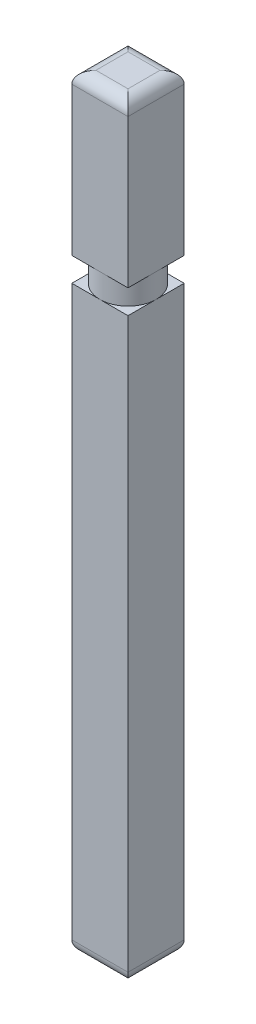
ISO-10303-21;
HEADER;
FILE_DESCRIPTION(('STEP AP214'),'2;1');
FILE_NAME('part.step','',(''),(''),'','','');
FILE_SCHEMA(('AUTOMOTIVE_DESIGN { 1 0 10303 214 1 1 1 1 }'));
ENDSEC;
DATA;
#1=APPLICATION_CONTEXT('core data for automotive mechanical design processes');
#2=APPLICATION_PROTOCOL_DEFINITION('international standard','automotive_design',2000,#1);
#3=PRODUCT_CONTEXT('',#1,'mechanical');
#4=PRODUCT('Part','Part','',(#3));
#5=PRODUCT_RELATED_PRODUCT_CATEGORY('part','',(#4));
#6=PRODUCT_DEFINITION_FORMATION('','',#4);
#7=PRODUCT_DEFINITION_CONTEXT('part definition',#1,'design');
#8=PRODUCT_DEFINITION('design','',#6,#7);
#9=PRODUCT_DEFINITION_SHAPE('','',#8);
#10=(LENGTH_UNIT() NAMED_UNIT(*) SI_UNIT(.MILLI.,.METRE.));
#11=(NAMED_UNIT(*) PLANE_ANGLE_UNIT() SI_UNIT($,.RADIAN.));
#12=(NAMED_UNIT(*) SI_UNIT($,.STERADIAN.) SOLID_ANGLE_UNIT());
#13=UNCERTAINTY_MEASURE_WITH_UNIT(LENGTH_MEASURE(1.E-05),#10,'distance_accuracy_value','');
#14=(GEOMETRIC_REPRESENTATION_CONTEXT(3) GLOBAL_UNCERTAINTY_ASSIGNED_CONTEXT((#13)) GLOBAL_UNIT_ASSIGNED_CONTEXT((#10,
#11,#12)) REPRESENTATION_CONTEXT('',''));
#15=CARTESIAN_POINT('',(0.,0.,0.));
#16=DIRECTION('',(0.,0.,1.));
#17=DIRECTION('',(1.,0.,0.));
#18=AXIS2_PLACEMENT_3D('',#15,#16,#17);
#19=CARTESIAN_POINT('',(0.,9.39,0.2));
#20=DIRECTION('',(-1.,0.,0.));
#21=DIRECTION('',(0.,0.,1.));
#22=AXIS2_PLACEMENT_3D('',#19,#20,#21);
#23=CYLINDRICAL_SURFACE('',#22,0.15);
#24=CARTESIAN_POINT('',(0.2,9.39,0.2));
#25=DIRECTION('',(-0.707106781186547,0.,0.707106781186548));
#26=DIRECTION('',(0.707106781186547,0.,0.707106781186547));
#27=AXIS2_PLACEMENT_3D('',#24,#25,#26);
#28=ELLIPSE('',#27,0.212132034355964,0.15);
#29=CARTESIAN_POINT('',(0.2,9.54,0.2));
#30=VERTEX_POINT('',#29);
#31=CARTESIAN_POINT('',(0.35,9.39,0.35));
#32=VERTEX_POINT('',#31);
#33=EDGE_CURVE('E201',#30,#32,#28,.F.);
#34=ORIENTED_EDGE('',*,*,#33,.F.);
#35=DIRECTION('',(1.,0.,0.));
#36=VECTOR('',#35,1.);
#37=CARTESIAN_POINT('',(0.,9.54,0.2));
#38=LINE('',#37,#36);
#39=CARTESIAN_POINT('',(-0.2,9.54,0.2));
#40=VERTEX_POINT('',#39);
#41=EDGE_CURVE('E144',#40,#30,#38,.T.);
#42=ORIENTED_EDGE('',*,*,#41,.F.);
#43=CARTESIAN_POINT('',(-0.2,9.39,0.2));
#44=DIRECTION('',(-0.707106781186548,0.,-0.707106781186547));
#45=DIRECTION('',(0.707106781186547,0.,-0.707106781186548));
#46=AXIS2_PLACEMENT_3D('',#43,#44,#45);
#47=ELLIPSE('',#46,0.212132034355964,0.15);
#48=CARTESIAN_POINT('',(-0.35,9.39,0.35));
#49=VERTEX_POINT('',#48);
#50=EDGE_CURVE('E20',#49,#40,#47,.T.);
#51=ORIENTED_EDGE('',*,*,#50,.F.);
#52=DIRECTION('',(-1.,0.,0.));
#53=VECTOR('',#52,1.);
#54=CARTESIAN_POINT('',(-0.35,9.39,0.35));
#55=LINE('',#54,#53);
#56=EDGE_CURVE('E129',#49,#32,#55,.F.);
#57=ORIENTED_EDGE('',*,*,#56,.T.);
#58=EDGE_LOOP('',(#34,#42,#51,#57));
#59=FACE_BOUND('',#58,.T.);
#60=ADVANCED_FACE('F17',(#59),#23,.T.);
#61=CARTESIAN_POINT('',(0.,9.54,0.));
#62=DIRECTION('',(0.,1.,0.));
#63=DIRECTION('',(0.,0.,1.));
#64=AXIS2_PLACEMENT_3D('',#61,#62,#63);
#65=PLANE('',#64);
#66=DIRECTION('',(0.,0.,-1.));
#67=VECTOR('',#66,1.);
#68=CARTESIAN_POINT('',(-0.2,9.54,0.));
#69=LINE('',#68,#67);
#70=CARTESIAN_POINT('',(-0.2,9.54,-0.2));
#71=VERTEX_POINT('',#70);
#72=EDGE_CURVE('E149',#40,#71,#69,.T.);
#73=ORIENTED_EDGE('',*,*,#72,.F.);
#74=ORIENTED_EDGE('',*,*,#41,.T.);
#75=DIRECTION('',(0.,0.,1.));
#76=VECTOR('',#75,1.);
#77=CARTESIAN_POINT('',(0.2,9.54,0.));
#78=LINE('',#77,#76);
#79=CARTESIAN_POINT('',(0.2,9.54,-0.2));
#80=VERTEX_POINT('',#79);
#81=EDGE_CURVE('E140',#80,#30,#78,.T.);
#82=ORIENTED_EDGE('',*,*,#81,.F.);
#83=DIRECTION('',(1.,0.,0.));
#84=VECTOR('',#83,1.);
#85=CARTESIAN_POINT('',(0.,9.54,-0.2));
#86=LINE('',#85,#84);
#87=EDGE_CURVE('E165',#71,#80,#86,.T.);
#88=ORIENTED_EDGE('',*,*,#87,.F.);
#89=EDGE_LOOP('',(#73,#74,#82,#88));
#90=FACE_BOUND('',#89,.T.);
#91=ADVANCED_FACE('F508',(#90),#65,.T.);
#92=CARTESIAN_POINT('',(-0.2,9.39,0.));
#93=DIRECTION('',(0.,0.,-1.));
#94=DIRECTION('',(-1.,0.,0.));
#95=AXIS2_PLACEMENT_3D('',#92,#93,#94);
#96=CYLINDRICAL_SURFACE('',#95,0.15);
#97=CARTESIAN_POINT('',(-0.2,9.39,-0.2));
#98=DIRECTION('',(0.707106781186547,0.,-0.707106781186548));
#99=DIRECTION('',(0.707106781186548,0.,0.707106781186547));
#100=AXIS2_PLACEMENT_3D('',#97,#98,#99);
#101=ELLIPSE('',#100,0.212132034355964,0.15);
#102=CARTESIAN_POINT('',(-0.35,9.39,-0.35));
#103=VERTEX_POINT('',#102);
#104=EDGE_CURVE('E162',#103,#71,#101,.T.);
#105=ORIENTED_EDGE('',*,*,#104,.F.);
#106=DIRECTION('',(0.,0.,-1.));
#107=VECTOR('',#106,1.);
#108=CARTESIAN_POINT('',(-0.35,9.39,-0.35));
#109=LINE('',#108,#107);
#110=EDGE_CURVE('E154',#103,#49,#109,.F.);
#111=ORIENTED_EDGE('',*,*,#110,.T.);
#112=ORIENTED_EDGE('',*,*,#50,.T.);
#113=ORIENTED_EDGE('',*,*,#72,.T.);
#114=EDGE_LOOP('',(#105,#111,#112,#113));
#115=FACE_BOUND('',#114,.T.);
#116=ADVANCED_FACE('F160',(#115),#96,.T.);
#117=CARTESIAN_POINT('',(0.2,9.39,0.));
#118=DIRECTION('',(0.,0.,1.));
#119=DIRECTION('',(1.,0.,0.));
#120=AXIS2_PLACEMENT_3D('',#117,#118,#119);
#121=CYLINDRICAL_SURFACE('',#120,0.15);
#122=CARTESIAN_POINT('',(0.2,9.39,-0.2));
#123=DIRECTION('',(0.707106781186547,0.,0.707106781186547));
#124=DIRECTION('',(0.707106781186547,0.,-0.707106781186548));
#125=AXIS2_PLACEMENT_3D('',#122,#123,#124);
#126=ELLIPSE('',#125,0.212132034355964,0.15);
#127=CARTESIAN_POINT('',(0.35,9.39,-0.35));
#128=VERTEX_POINT('',#127);
#129=EDGE_CURVE('E210',#80,#128,#126,.F.);
#130=ORIENTED_EDGE('',*,*,#129,.F.);
#131=ORIENTED_EDGE('',*,*,#81,.T.);
#132=ORIENTED_EDGE('',*,*,#33,.T.);
#133=DIRECTION('',(0.,0.,1.));
#134=VECTOR('',#133,1.);
#135=CARTESIAN_POINT('',(0.35,9.39,-0.35));
#136=LINE('',#135,#134);
#137=EDGE_CURVE('E182',#32,#128,#136,.F.);
#138=ORIENTED_EDGE('',*,*,#137,.T.);
#139=EDGE_LOOP('',(#130,#131,#132,#138));
#140=FACE_BOUND('',#139,.T.);
#141=ADVANCED_FACE('F278',(#140),#121,.T.);
#142=CARTESIAN_POINT('',(-0.35,9.54,0.35));
#143=DIRECTION('',(0.,0.,-1.));
#144=DIRECTION('',(-1.,0.,0.));
#145=AXIS2_PLACEMENT_3D('',#142,#143,#144);
#146=PLANE('',#145);
#147=DIRECTION('',(-1.,0.,0.));
#148=VECTOR('',#147,1.);
#149=CARTESIAN_POINT('',(-0.35,7.54,0.35));
#150=LINE('',#149,#148);
#151=CARTESIAN_POINT('',(0.,7.54,0.35));
#152=VERTEX_POINT('',#151);
#153=CARTESIAN_POINT('',(-0.35,7.54,0.35));
#154=VERTEX_POINT('',#153);
#155=EDGE_CURVE('E195',#152,#154,#150,.T.);
#156=ORIENTED_EDGE('',*,*,#155,.F.);
#157=DIRECTION('',(-1.,0.,0.));
#158=VECTOR('',#157,1.);
#159=CARTESIAN_POINT('',(-0.35,7.54,0.35));
#160=LINE('',#159,#158);
#161=CARTESIAN_POINT('',(0.35,7.54,0.35));
#162=VERTEX_POINT('',#161);
#163=EDGE_CURVE('E139',#162,#152,#160,.T.);
#164=ORIENTED_EDGE('',*,*,#163,.F.);
#165=DIRECTION('',(0.,1.,0.));
#166=VECTOR('',#165,1.);
#167=CARTESIAN_POINT('',(0.35,9.54,0.35));
#168=LINE('',#167,#166);
#169=EDGE_CURVE('E135',#162,#32,#168,.T.);
#170=ORIENTED_EDGE('',*,*,#169,.T.);
#171=ORIENTED_EDGE('',*,*,#56,.F.);
#172=DIRECTION('',(0.,1.,0.));
#173=VECTOR('',#172,1.);
#174=CARTESIAN_POINT('',(-0.35,9.54,0.35));
#175=LINE('',#174,#173);
#176=EDGE_CURVE('E133',#49,#154,#175,.F.);
#177=ORIENTED_EDGE('',*,*,#176,.T.);
#178=EDGE_LOOP('',(#156,#164,#170,#171,#177));
#179=FACE_BOUND('',#178,.T.);
#180=ADVANCED_FACE('F131',(#179),#146,.F.);
#181=CARTESIAN_POINT('',(0.,9.39,-0.2));
#182=DIRECTION('',(1.,0.,0.));
#183=DIRECTION('',(0.,0.,-1.));
#184=AXIS2_PLACEMENT_3D('',#181,#182,#183);
#185=CYLINDRICAL_SURFACE('',#184,0.15);
#186=ORIENTED_EDGE('',*,*,#104,.T.);
#187=ORIENTED_EDGE('',*,*,#87,.T.);
#188=ORIENTED_EDGE('',*,*,#129,.T.);
#189=DIRECTION('',(1.,0.,0.));
#190=VECTOR('',#189,1.);
#191=CARTESIAN_POINT('',(-0.35,9.39,-0.35));
#192=LINE('',#191,#190);
#193=EDGE_CURVE('E176',#128,#103,#192,.F.);
#194=ORIENTED_EDGE('',*,*,#193,.T.);
#195=EDGE_LOOP('',(#186,#187,#188,#194));
#196=FACE_BOUND('',#195,.T.);
#197=ADVANCED_FACE('F499',(#196),#185,.T.);
#198=CARTESIAN_POINT('',(-0.35,9.54,-0.35));
#199=DIRECTION('',(1.,0.,0.));
#200=DIRECTION('',(0.,0.,-1.));
#201=AXIS2_PLACEMENT_3D('',#198,#199,#200);
#202=PLANE('',#201);
#203=DIRECTION('',(0.,0.,-1.));
#204=VECTOR('',#203,1.);
#205=CARTESIAN_POINT('',(-0.35,7.54,-0.35));
#206=LINE('',#205,#204);
#207=CARTESIAN_POINT('',(-0.35,7.54,0.));
#208=VERTEX_POINT('',#207);
#209=CARTESIAN_POINT('',(-0.35,7.54,-0.35));
#210=VERTEX_POINT('',#209);
#211=EDGE_CURVE('E186',#208,#210,#206,.T.);
#212=ORIENTED_EDGE('',*,*,#211,.F.);
#213=DIRECTION('',(0.,0.,-1.));
#214=VECTOR('',#213,1.);
#215=CARTESIAN_POINT('',(-0.35,7.54,-0.35));
#216=LINE('',#215,#214);
#217=EDGE_CURVE('E157',#154,#208,#216,.T.);
#218=ORIENTED_EDGE('',*,*,#217,.F.);
#219=ORIENTED_EDGE('',*,*,#176,.F.);
#220=ORIENTED_EDGE('',*,*,#110,.F.);
#221=DIRECTION('',(0.,1.,0.));
#222=VECTOR('',#221,1.);
#223=CARTESIAN_POINT('',(-0.35,9.54,-0.35));
#224=LINE('',#223,#222);
#225=EDGE_CURVE('E179',#103,#210,#224,.F.);
#226=ORIENTED_EDGE('',*,*,#225,.T.);
#227=EDGE_LOOP('',(#212,#218,#219,#220,#226));
#228=FACE_BOUND('',#227,.T.);
#229=ADVANCED_FACE('F152',(#228),#202,.F.);
#230=CARTESIAN_POINT('',(0.35,9.54,-0.35));
#231=DIRECTION('',(-1.,0.,0.));
#232=DIRECTION('',(0.,0.,1.));
#233=AXIS2_PLACEMENT_3D('',#230,#231,#232);
#234=PLANE('',#233);
#235=DIRECTION('',(0.,0.,1.));
#236=VECTOR('',#235,1.);
#237=CARTESIAN_POINT('',(0.35,7.54,0.));
#238=LINE('',#237,#236);
#239=CARTESIAN_POINT('',(0.35,7.54,0.));
#240=VERTEX_POINT('',#239);
#241=EDGE_CURVE('E180',#162,#240,#238,.F.);
#242=ORIENTED_EDGE('',*,*,#241,.T.);
#243=DIRECTION('',(0.,0.,1.));
#244=VECTOR('',#243,1.);
#245=CARTESIAN_POINT('',(0.35,7.54,0.));
#246=LINE('',#245,#244);
#247=CARTESIAN_POINT('',(0.35,7.54,-0.35));
#248=VERTEX_POINT('',#247);
#249=EDGE_CURVE('E189',#240,#248,#246,.F.);
#250=ORIENTED_EDGE('',*,*,#249,.T.);
#251=DIRECTION('',(0.,1.,0.));
#252=VECTOR('',#251,1.);
#253=CARTESIAN_POINT('',(0.35,9.54,-0.35));
#254=LINE('',#253,#252);
#255=EDGE_CURVE('E269',#248,#128,#254,.T.);
#256=ORIENTED_EDGE('',*,*,#255,.T.);
#257=ORIENTED_EDGE('',*,*,#137,.F.);
#258=ORIENTED_EDGE('',*,*,#169,.F.);
#259=EDGE_LOOP('',(#242,#250,#256,#257,#258));
#260=FACE_BOUND('',#259,.T.);
#261=ADVANCED_FACE('F282',(#260),#234,.F.);
#262=CARTESIAN_POINT('',(0.,7.54,0.));
#263=DIRECTION('',(0.,1.,0.));
#264=DIRECTION('',(0.,0.,1.));
#265=AXIS2_PLACEMENT_3D('',#262,#263,#264);
#266=PLANE('',#265);
#267=DIRECTION('',(1.,0.,0.));
#268=VECTOR('',#267,1.);
#269=CARTESIAN_POINT('',(-0.35,7.54,-0.35));
#270=LINE('',#269,#268);
#271=CARTESIAN_POINT('',(0.,7.54,-0.35));
#272=VERTEX_POINT('',#271);
#273=EDGE_CURVE('E289',#272,#248,#270,.T.);
#274=ORIENTED_EDGE('',*,*,#273,.T.);
#275=ORIENTED_EDGE('',*,*,#249,.F.);
#276=CARTESIAN_POINT('',(0.,7.54,0.));
#277=DIRECTION('',(0.,1.,0.));
#278=DIRECTION('',(0.,0.,1.));
#279=AXIS2_PLACEMENT_3D('',#276,#277,#278);
#280=CIRCLE('',#279,0.35);
#281=EDGE_CURVE('E265',#272,#240,#280,.F.);
#282=ORIENTED_EDGE('',*,*,#281,.F.);
#283=EDGE_LOOP('',(#274,#275,#282));
#284=FACE_BOUND('',#283,.T.);
#285=ADVANCED_FACE('F490',(#284),#266,.F.);
#286=CARTESIAN_POINT('',(0.,7.54,0.));
#287=DIRECTION('',(0.,1.,0.));
#288=DIRECTION('',(0.,0.,1.));
#289=AXIS2_PLACEMENT_3D('',#286,#287,#288);
#290=PLANE('',#289);
#291=ORIENTED_EDGE('',*,*,#241,.F.);
#292=ORIENTED_EDGE('',*,*,#163,.T.);
#293=CARTESIAN_POINT('',(0.,7.54,0.));
#294=DIRECTION('',(0.,1.,0.));
#295=DIRECTION('',(0.,0.,1.));
#296=AXIS2_PLACEMENT_3D('',#293,#294,#295);
#297=CIRCLE('',#296,0.35);
#298=EDGE_CURVE('E261',#240,#152,#297,.F.);
#299=ORIENTED_EDGE('',*,*,#298,.F.);
#300=EDGE_LOOP('',(#291,#292,#299));
#301=FACE_BOUND('',#300,.T.);
#302=ADVANCED_FACE('F487',(#301),#290,.F.);
#303=CARTESIAN_POINT('',(-0.35,9.54,-0.35));
#304=DIRECTION('',(0.,0.,1.));
#305=DIRECTION('',(1.,0.,0.));
#306=AXIS2_PLACEMENT_3D('',#303,#304,#305);
#307=PLANE('',#306);
#308=ORIENTED_EDGE('',*,*,#273,.F.);
#309=DIRECTION('',(1.,0.,0.));
#310=VECTOR('',#309,1.);
#311=CARTESIAN_POINT('',(0.,7.54,-0.35));
#312=LINE('',#311,#310);
#313=EDGE_CURVE('E260',#272,#210,#312,.F.);
#314=ORIENTED_EDGE('',*,*,#313,.T.);
#315=ORIENTED_EDGE('',*,*,#225,.F.);
#316=ORIENTED_EDGE('',*,*,#193,.F.);
#317=ORIENTED_EDGE('',*,*,#255,.F.);
#318=EDGE_LOOP('',(#308,#314,#315,#316,#317));
#319=FACE_BOUND('',#318,.T.);
#320=ADVANCED_FACE('F308',(#319),#307,.F.);
#321=CARTESIAN_POINT('',(0.2,0.150000000000001,-0.35));
#322=DIRECTION('',(0.,0.,-1.));
#323=DIRECTION('',(-1.,0.,0.));
#324=AXIS2_PLACEMENT_3D('',#321,#322,#323);
#325=CYLINDRICAL_SURFACE('',#324,0.15);
#326=CARTESIAN_POINT('',(0.2,0.150000000000001,0.2));
#327=DIRECTION('',(0.707106781186547,0.,-0.707106781186548));
#328=DIRECTION('',(0.707106781186547,0.,0.707106781186547));
#329=AXIS2_PLACEMENT_3D('',#326,#327,#328);
#330=ELLIPSE('',#329,0.212132034355964,0.15);
#331=CARTESIAN_POINT('',(0.2,0.,0.2));
#332=VERTEX_POINT('',#331);
#333=CARTESIAN_POINT('',(0.35,0.150000000000001,0.35));
#334=VERTEX_POINT('',#333);
#335=EDGE_CURVE('E252',#332,#334,#330,.F.);
#336=ORIENTED_EDGE('',*,*,#335,.F.);
#337=DIRECTION('',(0.,0.,1.));
#338=VECTOR('',#337,1.);
#339=CARTESIAN_POINT('',(0.2,0.,0.));
#340=LINE('',#339,#338);
#341=CARTESIAN_POINT('',(0.2,0.,-0.2));
#342=VERTEX_POINT('',#341);
#343=EDGE_CURVE('E259',#332,#342,#340,.F.);
#344=ORIENTED_EDGE('',*,*,#343,.T.);
#345=CARTESIAN_POINT('',(0.2,0.150000000000001,-0.2));
#346=DIRECTION('',(-0.707106781186547,0.,-0.707106781186547));
#347=DIRECTION('',(-0.707106781186547,0.,0.707106781186548));
#348=AXIS2_PLACEMENT_3D('',#345,#346,#347);
#349=ELLIPSE('',#348,0.212132034355964,0.15);
#350=CARTESIAN_POINT('',(0.35,0.150000000000001,-0.35));
#351=VERTEX_POINT('',#350);
#352=EDGE_CURVE('E248',#351,#342,#349,.T.);
#353=ORIENTED_EDGE('',*,*,#352,.F.);
#354=DIRECTION('',(0.,0.,1.));
#355=VECTOR('',#354,1.);
#356=CARTESIAN_POINT('',(0.35,0.150000000000001,-0.35));
#357=LINE('',#356,#355);
#358=EDGE_CURVE('E334',#351,#334,#357,.T.);
#359=ORIENTED_EDGE('',*,*,#358,.T.);
#360=EDGE_LOOP('',(#336,#344,#353,#359));
#361=FACE_BOUND('',#360,.T.);
#362=ADVANCED_FACE('F480',(#361),#325,.T.);
#363=CARTESIAN_POINT('',(0.,7.54,0.));
#364=DIRECTION('',(0.,1.,0.));
#365=DIRECTION('',(0.,0.,1.));
#366=AXIS2_PLACEMENT_3D('',#363,#364,#365);
#367=PLANE('',#366);
#368=ORIENTED_EDGE('',*,*,#155,.T.);
#369=ORIENTED_EDGE('',*,*,#217,.T.);
#370=CARTESIAN_POINT('',(0.,7.54,0.));
#371=DIRECTION('',(0.,1.,0.));
#372=DIRECTION('',(0.,0.,1.));
#373=AXIS2_PLACEMENT_3D('',#370,#371,#372);
#374=CIRCLE('',#373,0.35);
#375=EDGE_CURVE('E239',#152,#208,#374,.F.);
#376=ORIENTED_EDGE('',*,*,#375,.F.);
#377=EDGE_LOOP('',(#368,#369,#376));
#378=FACE_BOUND('',#377,.T.);
#379=ADVANCED_FACE('F477',(#378),#367,.F.);
#380=CARTESIAN_POINT('',(0.,7.54,0.));
#381=DIRECTION('',(0.,1.,0.));
#382=DIRECTION('',(0.,0.,1.));
#383=AXIS2_PLACEMENT_3D('',#380,#381,#382);
#384=PLANE('',#383);
#385=CARTESIAN_POINT('',(0.,7.54,0.));
#386=DIRECTION('',(0.,1.,0.));
#387=DIRECTION('',(0.,0.,1.));
#388=AXIS2_PLACEMENT_3D('',#385,#386,#387);
#389=CIRCLE('',#388,0.35);
#390=EDGE_CURVE('E235',#208,#272,#389,.F.);
#391=ORIENTED_EDGE('',*,*,#390,.F.);
#392=ORIENTED_EDGE('',*,*,#211,.T.);
#393=ORIENTED_EDGE('',*,*,#313,.F.);
#394=EDGE_LOOP('',(#391,#392,#393));
#395=FACE_BOUND('',#394,.T.);
#396=ADVANCED_FACE('F303',(#395),#384,.F.);
#397=CARTESIAN_POINT('',(0.,7.24,0.));
#398=DIRECTION('',(0.,1.,0.));
#399=DIRECTION('',(0.,0.,1.));
#400=AXIS2_PLACEMENT_3D('',#397,#398,#399);
#401=PLANE('',#400);
#402=DIRECTION('',(0.,0.,1.));
#403=VECTOR('',#402,1.);
#404=CARTESIAN_POINT('',(0.35,7.24,-0.35));
#405=LINE('',#404,#403);
#406=CARTESIAN_POINT('',(0.35,7.24,0.35));
#407=VERTEX_POINT('',#406);
#408=CARTESIAN_POINT('',(0.35,7.24,0.));
#409=VERTEX_POINT('',#408);
#410=EDGE_CURVE('E336',#407,#409,#405,.F.);
#411=ORIENTED_EDGE('',*,*,#410,.T.);
#412=CARTESIAN_POINT('',(0.,7.24,0.));
#413=DIRECTION('',(0.,1.,0.));
#414=DIRECTION('',(0.,0.,1.));
#415=AXIS2_PLACEMENT_3D('',#412,#413,#414);
#416=CIRCLE('',#415,0.35);
#417=CARTESIAN_POINT('',(0.,7.24,0.35));
#418=VERTEX_POINT('',#417);
#419=EDGE_CURVE('E256',#409,#418,#416,.F.);
#420=ORIENTED_EDGE('',*,*,#419,.T.);
#421=DIRECTION('',(-1.,0.,0.));
#422=VECTOR('',#421,1.);
#423=CARTESIAN_POINT('',(-0.35,7.24,0.35));
#424=LINE('',#423,#422);
#425=EDGE_CURVE('E234',#418,#407,#424,.F.);
#426=ORIENTED_EDGE('',*,*,#425,.T.);
#427=EDGE_LOOP('',(#411,#420,#426));
#428=FACE_BOUND('',#427,.T.);
#429=ADVANCED_FACE('F395',(#428),#401,.T.);
#430=CARTESIAN_POINT('',(0.,0.,0.));
#431=DIRECTION('',(0.,1.,0.));
#432=DIRECTION('',(0.,0.,1.));
#433=AXIS2_PLACEMENT_3D('',#430,#431,#432);
#434=PLANE('',#433);
#435=DIRECTION('',(1.,0.,0.));
#436=VECTOR('',#435,1.);
#437=CARTESIAN_POINT('',(-0.35,0.,0.2));
#438=LINE('',#437,#436);
#439=CARTESIAN_POINT('',(-0.2,0.,0.2));
#440=VERTEX_POINT('',#439);
#441=EDGE_CURVE('E255',#440,#332,#438,.T.);
#442=ORIENTED_EDGE('',*,*,#441,.F.);
#443=DIRECTION('',(0.,0.,1.));
#444=VECTOR('',#443,1.);
#445=CARTESIAN_POINT('',(-0.2,0.,-0.35));
#446=LINE('',#445,#444);
#447=CARTESIAN_POINT('',(-0.2,0.,-0.2));
#448=VERTEX_POINT('',#447);
#449=EDGE_CURVE('E225',#448,#440,#446,.T.);
#450=ORIENTED_EDGE('',*,*,#449,.F.);
#451=DIRECTION('',(-1.,0.,0.));
#452=VECTOR('',#451,1.);
#453=CARTESIAN_POINT('',(-0.35,0.,-0.2));
#454=LINE('',#453,#452);
#455=EDGE_CURVE('E251',#342,#448,#454,.T.);
#456=ORIENTED_EDGE('',*,*,#455,.F.);
#457=ORIENTED_EDGE('',*,*,#343,.F.);
#458=EDGE_LOOP('',(#442,#450,#456,#457));
#459=FACE_BOUND('',#458,.T.);
#460=ADVANCED_FACE('F468',(#459),#434,.F.);
#461=CARTESIAN_POINT('',(-0.35,0.150000000000001,0.2));
#462=DIRECTION('',(1.,0.,0.));
#463=DIRECTION('',(0.,0.,-1.));
#464=AXIS2_PLACEMENT_3D('',#461,#462,#463);
#465=CYLINDRICAL_SURFACE('',#464,0.15);
#466=ORIENTED_EDGE('',*,*,#335,.T.);
#467=DIRECTION('',(-1.,0.,0.));
#468=VECTOR('',#467,1.);
#469=CARTESIAN_POINT('',(-0.35,0.150000000000001,0.35));
#470=LINE('',#469,#468);
#471=CARTESIAN_POINT('',(-0.35,0.150000000000001,0.35));
#472=VERTEX_POINT('',#471);
#473=EDGE_CURVE('E355',#334,#472,#470,.T.);
#474=ORIENTED_EDGE('',*,*,#473,.T.);
#475=CARTESIAN_POINT('',(-0.2,0.150000000000001,0.2));
#476=DIRECTION('',(0.707106781186548,0.,0.707106781186547));
#477=DIRECTION('',(-0.707106781186547,0.,0.707106781186548));
#478=AXIS2_PLACEMENT_3D('',#475,#476,#477);
#479=ELLIPSE('',#478,0.212132034355964,0.15);
#480=EDGE_CURVE('E221',#440,#472,#479,.F.);
#481=ORIENTED_EDGE('',*,*,#480,.F.);
#482=ORIENTED_EDGE('',*,*,#441,.T.);
#483=EDGE_LOOP('',(#466,#474,#481,#482));
#484=FACE_BOUND('',#483,.T.);
#485=ADVANCED_FACE('F465',(#484),#465,.T.);
#486=CARTESIAN_POINT('',(-0.35,0.150000000000001,-0.2));
#487=DIRECTION('',(-1.,0.,0.));
#488=DIRECTION('',(0.,0.,1.));
#489=AXIS2_PLACEMENT_3D('',#486,#487,#488);
#490=CYLINDRICAL_SURFACE('',#489,0.15);
#491=CARTESIAN_POINT('',(-0.2,0.150000000000001,-0.2));
#492=DIRECTION('',(-0.707106781186547,0.,0.707106781186548));
#493=DIRECTION('',(0.707106781186548,0.,0.707106781186547));
#494=AXIS2_PLACEMENT_3D('',#491,#492,#493);
#495=ELLIPSE('',#494,0.212132034355964,0.15);
#496=CARTESIAN_POINT('',(-0.35,0.150000000000001,-0.35));
#497=VERTEX_POINT('',#496);
#498=EDGE_CURVE('E226',#497,#448,#495,.T.);
#499=ORIENTED_EDGE('',*,*,#498,.F.);
#500=DIRECTION('',(1.,0.,0.));
#501=VECTOR('',#500,1.);
#502=CARTESIAN_POINT('',(-0.35,0.150000000000001,-0.35));
#503=LINE('',#502,#501);
#504=EDGE_CURVE('E224',#497,#351,#503,.T.);
#505=ORIENTED_EDGE('',*,*,#504,.T.);
#506=ORIENTED_EDGE('',*,*,#352,.T.);
#507=ORIENTED_EDGE('',*,*,#455,.T.);
#508=EDGE_LOOP('',(#499,#505,#506,#507));
#509=FACE_BOUND('',#508,.T.);
#510=ADVANCED_FACE('F413',(#509),#490,.T.);
#511=CARTESIAN_POINT('',(0.35,9.54,-0.35));
#512=DIRECTION('',(-1.,0.,0.));
#513=DIRECTION('',(0.,0.,1.));
#514=AXIS2_PLACEMENT_3D('',#511,#512,#513);
#515=PLANE('',#514);
#516=DIRECTION('',(0.,1.,0.));
#517=VECTOR('',#516,1.);
#518=CARTESIAN_POINT('',(0.35,9.54,0.35));
#519=LINE('',#518,#517);
#520=EDGE_CURVE('E358',#407,#334,#519,.F.);
#521=ORIENTED_EDGE('',*,*,#520,.T.);
#522=ORIENTED_EDGE('',*,*,#358,.F.);
#523=DIRECTION('',(0.,1.,0.));
#524=VECTOR('',#523,1.);
#525=CARTESIAN_POINT('',(0.35,9.54,-0.35));
#526=LINE('',#525,#524);
#527=CARTESIAN_POINT('',(0.35,7.24,-0.35));
#528=VERTEX_POINT('',#527);
#529=EDGE_CURVE('E367',#351,#528,#526,.T.);
#530=ORIENTED_EDGE('',*,*,#529,.T.);
#531=DIRECTION('',(0.,0.,1.));
#532=VECTOR('',#531,1.);
#533=CARTESIAN_POINT('',(0.35,7.24,0.));
#534=LINE('',#533,#532);
#535=EDGE_CURVE('E247',#409,#528,#534,.F.);
#536=ORIENTED_EDGE('',*,*,#535,.F.);
#537=ORIENTED_EDGE('',*,*,#410,.F.);
#538=EDGE_LOOP('',(#521,#522,#530,#536,#537));
#539=FACE_BOUND('',#538,.T.);
#540=ADVANCED_FACE('F405',(#539),#515,.F.);
#541=CARTESIAN_POINT('',(0.,7.24,0.));
#542=DIRECTION('',(0.,1.,0.));
#543=DIRECTION('',(0.,0.,1.));
#544=AXIS2_PLACEMENT_3D('',#541,#542,#543);
#545=PLANE('',#544);
#546=DIRECTION('',(1.,0.,0.));
#547=VECTOR('',#546,1.);
#548=CARTESIAN_POINT('',(-0.35,7.24,-0.35));
#549=LINE('',#548,#547);
#550=CARTESIAN_POINT('',(0.,7.24,-0.35));
#551=VERTEX_POINT('',#550);
#552=EDGE_CURVE('E220',#528,#551,#549,.F.);
#553=ORIENTED_EDGE('',*,*,#552,.T.);
#554=CARTESIAN_POINT('',(0.,7.24,0.));
#555=DIRECTION('',(0.,1.,0.));
#556=DIRECTION('',(0.,0.,1.));
#557=AXIS2_PLACEMENT_3D('',#554,#555,#556);
#558=CIRCLE('',#557,0.35);
#559=EDGE_CURVE('E243',#551,#409,#558,.F.);
#560=ORIENTED_EDGE('',*,*,#559,.T.);
#561=ORIENTED_EDGE('',*,*,#535,.T.);
#562=EDGE_LOOP('',(#553,#560,#561));
#563=FACE_BOUND('',#562,.T.);
#564=ADVANCED_FACE('F401',(#563),#545,.T.);
#565=CARTESIAN_POINT('',(0.,7.24,0.));
#566=DIRECTION('',(0.,1.,0.));
#567=DIRECTION('',(0.,0.,1.));
#568=AXIS2_PLACEMENT_3D('',#565,#566,#567);
#569=CYLINDRICAL_SURFACE('',#568,0.35);
#570=ORIENTED_EDGE('',*,*,#559,.F.);
#571=CARTESIAN_POINT('',(0.,7.24,0.));
#572=DIRECTION('',(0.,1.,0.));
#573=DIRECTION('',(0.,0.,1.));
#574=AXIS2_PLACEMENT_3D('',#571,#572,#573);
#575=CIRCLE('',#574,0.35);
#576=CARTESIAN_POINT('',(-0.35,7.24,0.));
#577=VERTEX_POINT('',#576);
#578=EDGE_CURVE('E217',#577,#551,#575,.F.);
#579=ORIENTED_EDGE('',*,*,#578,.F.);
#580=CARTESIAN_POINT('',(0.,7.24,0.));
#581=DIRECTION('',(0.,1.,0.));
#582=DIRECTION('',(0.,0.,1.));
#583=AXIS2_PLACEMENT_3D('',#580,#581,#582);
#584=CIRCLE('',#583,0.35);
#585=EDGE_CURVE('E231',#418,#577,#584,.F.);
#586=ORIENTED_EDGE('',*,*,#585,.F.);
#587=ORIENTED_EDGE('',*,*,#419,.F.);
#588=EDGE_LOOP('',(#570,#579,#586,#587));
#589=FACE_BOUND('',#588,.T.);
#590=ORIENTED_EDGE('',*,*,#375,.T.);
#591=ORIENTED_EDGE('',*,*,#390,.T.);
#592=ORIENTED_EDGE('',*,*,#281,.T.);
#593=ORIENTED_EDGE('',*,*,#298,.T.);
#594=EDGE_LOOP('',(#590,#591,#592,#593));
#595=FACE_BOUND('',#594,.T.);
#596=ADVANCED_FACE('F435',(#589,#595),#569,.T.);
#597=CARTESIAN_POINT('',(0.,7.24,0.));
#598=DIRECTION('',(0.,1.,0.));
#599=DIRECTION('',(0.,0.,1.));
#600=AXIS2_PLACEMENT_3D('',#597,#598,#599);
#601=PLANE('',#600);
#602=DIRECTION('',(-1.,0.,0.));
#603=VECTOR('',#602,1.);
#604=CARTESIAN_POINT('',(-0.35,7.24,0.35));
#605=LINE('',#604,#603);
#606=CARTESIAN_POINT('',(-0.35,7.24,0.35));
#607=VERTEX_POINT('',#606);
#608=EDGE_CURVE('E230',#607,#418,#605,.F.);
#609=ORIENTED_EDGE('',*,*,#608,.T.);
#610=ORIENTED_EDGE('',*,*,#585,.T.);
#611=DIRECTION('',(0.,0.,-1.));
#612=VECTOR('',#611,1.);
#613=CARTESIAN_POINT('',(-0.35,7.24,-0.35));
#614=LINE('',#613,#612);
#615=EDGE_CURVE('E331',#577,#607,#614,.F.);
#616=ORIENTED_EDGE('',*,*,#615,.T.);
#617=EDGE_LOOP('',(#609,#610,#616));
#618=FACE_BOUND('',#617,.T.);
#619=ADVANCED_FACE('F429',(#618),#601,.T.);
#620=CARTESIAN_POINT('',(-0.35,9.54,0.35));
#621=DIRECTION('',(0.,0.,-1.));
#622=DIRECTION('',(-1.,0.,0.));
#623=AXIS2_PLACEMENT_3D('',#620,#621,#622);
#624=PLANE('',#623);
#625=DIRECTION('',(0.,1.,0.));
#626=VECTOR('',#625,1.);
#627=CARTESIAN_POINT('',(-0.35,9.54,0.35));
#628=LINE('',#627,#626);
#629=EDGE_CURVE('E350',#607,#472,#628,.F.);
#630=ORIENTED_EDGE('',*,*,#629,.T.);
#631=ORIENTED_EDGE('',*,*,#473,.F.);
#632=ORIENTED_EDGE('',*,*,#520,.F.);
#633=ORIENTED_EDGE('',*,*,#425,.F.);
#634=ORIENTED_EDGE('',*,*,#608,.F.);
#635=EDGE_LOOP('',(#630,#631,#632,#633,#634));
#636=FACE_BOUND('',#635,.T.);
#637=ADVANCED_FACE('F451',(#636),#624,.F.);
#638=CARTESIAN_POINT('',(-0.2,0.150000000000001,-0.35));
#639=DIRECTION('',(0.,0.,1.));
#640=DIRECTION('',(1.,0.,0.));
#641=AXIS2_PLACEMENT_3D('',#638,#639,#640);
#642=CYLINDRICAL_SURFACE('',#641,0.15);
#643=ORIENTED_EDGE('',*,*,#480,.T.);
#644=DIRECTION('',(0.,0.,-1.));
#645=VECTOR('',#644,1.);
#646=CARTESIAN_POINT('',(-0.35,0.150000000000001,-0.35));
#647=LINE('',#646,#645);
#648=EDGE_CURVE('E340',#472,#497,#647,.T.);
#649=ORIENTED_EDGE('',*,*,#648,.T.);
#650=ORIENTED_EDGE('',*,*,#498,.T.);
#651=ORIENTED_EDGE('',*,*,#449,.T.);
#652=EDGE_LOOP('',(#643,#649,#650,#651));
#653=FACE_BOUND('',#652,.T.);
#654=ADVANCED_FACE('F446',(#653),#642,.T.);
#655=CARTESIAN_POINT('',(-0.35,9.54,-0.35));
#656=DIRECTION('',(0.,0.,1.));
#657=DIRECTION('',(1.,0.,0.));
#658=AXIS2_PLACEMENT_3D('',#655,#656,#657);
#659=PLANE('',#658);
#660=ORIENTED_EDGE('',*,*,#529,.F.);
#661=ORIENTED_EDGE('',*,*,#504,.F.);
#662=DIRECTION('',(0.,1.,0.));
#663=VECTOR('',#662,1.);
#664=CARTESIAN_POINT('',(-0.35,9.54,-0.35));
#665=LINE('',#664,#663);
#666=CARTESIAN_POINT('',(-0.35,7.24,-0.35));
#667=VERTEX_POINT('',#666);
#668=EDGE_CURVE('E27',#497,#667,#665,.T.);
#669=ORIENTED_EDGE('',*,*,#668,.T.);
#670=DIRECTION('',(1.,0.,0.));
#671=VECTOR('',#670,1.);
#672=CARTESIAN_POINT('',(0.,7.24,-0.35));
#673=LINE('',#672,#671);
#674=EDGE_CURVE('E35',#551,#667,#673,.F.);
#675=ORIENTED_EDGE('',*,*,#674,.F.);
#676=ORIENTED_EDGE('',*,*,#552,.F.);
#677=EDGE_LOOP('',(#660,#661,#669,#675,#676));
#678=FACE_BOUND('',#677,.T.);
#679=ADVANCED_FACE('F410',(#678),#659,.F.);
#680=CARTESIAN_POINT('',(0.,7.24,0.));
#681=DIRECTION('',(0.,1.,0.));
#682=DIRECTION('',(0.,0.,1.));
#683=AXIS2_PLACEMENT_3D('',#680,#681,#682);
#684=PLANE('',#683);
#685=ORIENTED_EDGE('',*,*,#578,.T.);
#686=ORIENTED_EDGE('',*,*,#674,.T.);
#687=DIRECTION('',(0.,0.,-1.));
#688=VECTOR('',#687,1.);
#689=CARTESIAN_POINT('',(-0.35,7.24,-0.35));
#690=LINE('',#689,#688);
#691=EDGE_CURVE('E11',#667,#577,#690,.F.);
#692=ORIENTED_EDGE('',*,*,#691,.T.);
#693=EDGE_LOOP('',(#685,#686,#692));
#694=FACE_BOUND('',#693,.T.);
#695=ADVANCED_FACE('F437',(#694),#684,.T.);
#696=CARTESIAN_POINT('',(-0.35,9.54,-0.35));
#697=DIRECTION('',(1.,0.,0.));
#698=DIRECTION('',(0.,0.,-1.));
#699=AXIS2_PLACEMENT_3D('',#696,#697,#698);
#700=PLANE('',#699);
#701=ORIENTED_EDGE('',*,*,#668,.F.);
#702=ORIENTED_EDGE('',*,*,#648,.F.);
#703=ORIENTED_EDGE('',*,*,#629,.F.);
#704=ORIENTED_EDGE('',*,*,#615,.F.);
#705=ORIENTED_EDGE('',*,*,#691,.F.);
#706=EDGE_LOOP('',(#701,#702,#703,#704,#705));
#707=FACE_BOUND('',#706,.T.);
#708=ADVANCED_FACE('F433',(#707),#700,.F.);
#709=CLOSED_SHELL('',(#60,#91,#116,#141,#180,#197,#229,#261,#285,#302,#320,#362,#379,#396,#429,
#460,#485,#510,#540,#564,#596,#619,#637,#654,#679,#695,#708));
#710=MANIFOLD_SOLID_BREP('B1',#709);
#711=ADVANCED_BREP_SHAPE_REPRESENTATION('',(#18,#710),#14);
#712=SHAPE_DEFINITION_REPRESENTATION(#9,#711);
ENDSEC;
END-ISO-10303-21;
